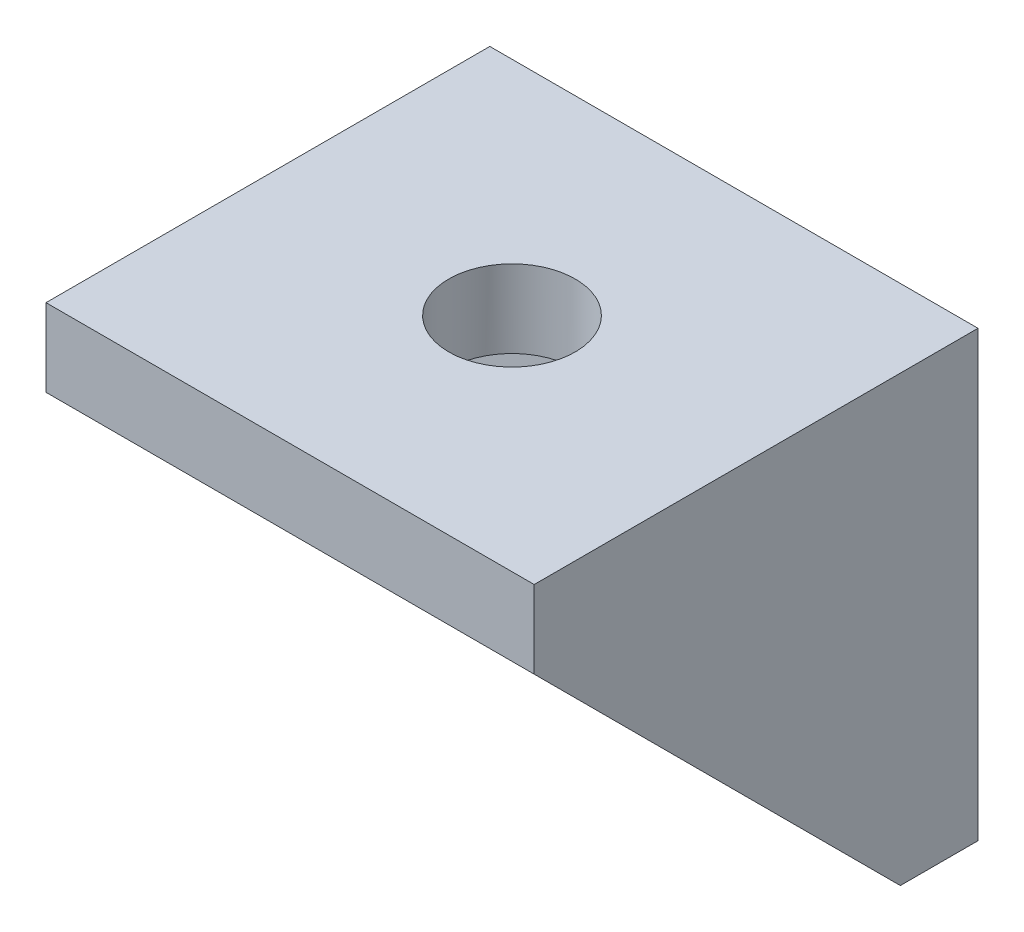
ISO-10303-21;
HEADER;
FILE_DESCRIPTION(('STEP AP214'),'2;1');
FILE_NAME('part.step','',(''),(''),'','','');
FILE_SCHEMA(('AUTOMOTIVE_DESIGN { 1 0 10303 214 1 1 1 1 }'));
ENDSEC;
DATA;
#1=APPLICATION_CONTEXT('core data for automotive mechanical design processes');
#2=APPLICATION_PROTOCOL_DEFINITION('international standard','automotive_design',2000,#1);
#3=PRODUCT_CONTEXT('',#1,'mechanical');
#4=PRODUCT('Part','Part','',(#3));
#5=PRODUCT_RELATED_PRODUCT_CATEGORY('part','',(#4));
#6=PRODUCT_DEFINITION_FORMATION('','',#4);
#7=PRODUCT_DEFINITION_CONTEXT('part definition',#1,'design');
#8=PRODUCT_DEFINITION('design','',#6,#7);
#9=PRODUCT_DEFINITION_SHAPE('','',#8);
#10=(LENGTH_UNIT() NAMED_UNIT(*) SI_UNIT(.MILLI.,.METRE.));
#11=(NAMED_UNIT(*) PLANE_ANGLE_UNIT() SI_UNIT($,.RADIAN.));
#12=(NAMED_UNIT(*) SI_UNIT($,.STERADIAN.) SOLID_ANGLE_UNIT());
#13=UNCERTAINTY_MEASURE_WITH_UNIT(LENGTH_MEASURE(1.E-05),#10,'distance_accuracy_value','');
#14=(GEOMETRIC_REPRESENTATION_CONTEXT(3) GLOBAL_UNCERTAINTY_ASSIGNED_CONTEXT((#13)) GLOBAL_UNIT_ASSIGNED_CONTEXT((#10,
#11,#12)) REPRESENTATION_CONTEXT('',''));
#15=CARTESIAN_POINT('',(0.,0.,0.));
#16=DIRECTION('',(0.,0.,1.));
#17=DIRECTION('',(1.,0.,0.));
#18=AXIS2_PLACEMENT_3D('',#15,#16,#17);
#19=CARTESIAN_POINT('',(-8.99999999999968,0.,9.99999999999888));
#20=DIRECTION('',(0.,0.,1.));
#21=DIRECTION('',(1.,0.,0.));
#22=AXIS2_PLACEMENT_3D('',#19,#20,#21);
#23=PLANE('',#22);
#24=DIRECTION('',(1.,0.,0.));
#25=VECTOR('',#24,1.);
#26=CARTESIAN_POINT('',(-8.99999999999968,0.,9.99999999999888));
#27=LINE('',#26,#25);
#28=CARTESIAN_POINT('',(-10.9999999999997,0.,9.99999999999888));
#29=VERTEX_POINT('',#28);
#30=CARTESIAN_POINT('',(-8.99999999999968,0.,9.99999999999888));
#31=VERTEX_POINT('',#30);
#32=EDGE_CURVE('E66',#29,#31,#27,.T.);
#33=ORIENTED_EDGE('',*,*,#32,.T.);
#34=DIRECTION('',(-1.,0.,0.));
#35=VECTOR('',#34,1.);
#36=CARTESIAN_POINT('',(8.99999999999968,0.,9.99999999999888));
#37=LINE('',#36,#35);
#38=CARTESIAN_POINT('',(8.99999999999968,0.,9.99999999999888));
#39=VERTEX_POINT('',#38);
#40=EDGE_CURVE('E234',#39,#31,#37,.T.);
#41=ORIENTED_EDGE('',*,*,#40,.F.);
#42=DIRECTION('',(1.,0.,0.));
#43=VECTOR('',#42,1.);
#44=CARTESIAN_POINT('',(-8.99999999999968,0.,9.99999999999888));
#45=LINE('',#44,#43);
#46=CARTESIAN_POINT('',(10.9999999999997,0.,9.99999999999888));
#47=VERTEX_POINT('',#46);
#48=EDGE_CURVE('E230',#39,#47,#45,.T.);
#49=ORIENTED_EDGE('',*,*,#48,.T.);
#50=DIRECTION('',(0.,-1.,0.));
#51=VECTOR('',#50,1.);
#52=CARTESIAN_POINT('',(10.9999999999997,3.49999999999999,9.99999999999888));
#53=LINE('',#52,#51);
#54=CARTESIAN_POINT('',(10.9999999999997,3.49999999999999,9.99999999999888));
#55=VERTEX_POINT('',#54);
#56=EDGE_CURVE('E162',#55,#47,#53,.T.);
#57=ORIENTED_EDGE('',*,*,#56,.F.);
#58=DIRECTION('',(1.,0.,0.));
#59=VECTOR('',#58,1.);
#60=CARTESIAN_POINT('',(10.9999999999997,3.49999999999999,9.99999999999888));
#61=LINE('',#60,#59);
#62=CARTESIAN_POINT('',(-10.9999999999997,3.49999999999999,9.99999999999888));
#63=VERTEX_POINT('',#62);
#64=EDGE_CURVE('E121',#63,#55,#61,.T.);
#65=ORIENTED_EDGE('',*,*,#64,.F.);
#66=DIRECTION('',(0.,-1.,0.));
#67=VECTOR('',#66,1.);
#68=CARTESIAN_POINT('',(-10.9999999999997,3.49999999999999,9.99999999999888));
#69=LINE('',#68,#67);
#70=EDGE_CURVE('E118',#63,#29,#69,.T.);
#71=ORIENTED_EDGE('',*,*,#70,.T.);
#72=EDGE_LOOP('',(#33,#41,#49,#57,#65,#71));
#73=FACE_BOUND('',#72,.T.);
#74=ADVANCED_FACE('F40',(#73),#23,.T.);
#75=CARTESIAN_POINT('',(10.9999999999997,-6.5,-1.12132525487141E-12));
#76=DIRECTION('',(-1.,0.,0.));
#77=DIRECTION('',(0.,0.,1.));
#78=AXIS2_PLACEMENT_3D('',#75,#76,#77);
#79=PLANE('',#78);
#80=DIRECTION('',(0.,0.707106781186547,0.707106781186547));
#81=VECTOR('',#80,1.);
#82=CARTESIAN_POINT('',(10.9999999999997,-16.5,-6.50000000000112));
#83=LINE('',#82,#81);
#84=CARTESIAN_POINT('',(10.9999999999997,-16.5,-6.50000000000112));
#85=VERTEX_POINT('',#84);
#86=EDGE_CURVE('E420',#85,#47,#83,.T.);
#87=ORIENTED_EDGE('',*,*,#86,.F.);
#88=DIRECTION('',(0.,0.,1.));
#89=VECTOR('',#88,1.);
#90=CARTESIAN_POINT('',(10.9999999999997,-16.5,-10.0000000000011));
#91=LINE('',#90,#89);
#92=CARTESIAN_POINT('',(10.9999999999997,-16.5,-10.0000000000011));
#93=VERTEX_POINT('',#92);
#94=EDGE_CURVE('E150',#93,#85,#91,.T.);
#95=ORIENTED_EDGE('',*,*,#94,.F.);
#96=DIRECTION('',(0.,-1.,0.));
#97=VECTOR('',#96,1.);
#98=CARTESIAN_POINT('',(10.9999999999997,-16.5,-10.0000000000011));
#99=LINE('',#98,#97);
#100=CARTESIAN_POINT('',(10.9999999999997,3.5,-10.0000000000011));
#101=VERTEX_POINT('',#100);
#102=EDGE_CURVE('E131',#101,#93,#99,.T.);
#103=ORIENTED_EDGE('',*,*,#102,.F.);
#104=DIRECTION('',(0.,0.,-1.));
#105=VECTOR('',#104,1.);
#106=CARTESIAN_POINT('',(10.9999999999997,3.49999999999999,-6.50000000000112));
#107=LINE('',#106,#105);
#108=EDGE_CURVE('E128',#55,#101,#107,.T.);
#109=ORIENTED_EDGE('',*,*,#108,.F.);
#110=ORIENTED_EDGE('',*,*,#56,.T.);
#111=EDGE_LOOP('',(#87,#95,#103,#109,#110));
#112=FACE_BOUND('',#111,.T.);
#113=ADVANCED_FACE('F273',(#112),#79,.F.);
#114=CARTESIAN_POINT('',(-10.9999999999997,-6.5,-1.12132525487141E-12));
#115=DIRECTION('',(-1.,0.,0.));
#116=DIRECTION('',(0.,0.,1.));
#117=AXIS2_PLACEMENT_3D('',#114,#115,#116);
#118=PLANE('',#117);
#119=DIRECTION('',(0.,0.707106781186547,0.707106781186547));
#120=VECTOR('',#119,1.);
#121=CARTESIAN_POINT('',(-10.9999999999997,-16.5,-6.50000000000112));
#122=LINE('',#121,#120);
#123=CARTESIAN_POINT('',(-10.9999999999997,-16.5,-6.50000000000112));
#124=VERTEX_POINT('',#123);
#125=EDGE_CURVE('E12',#124,#29,#122,.T.);
#126=ORIENTED_EDGE('',*,*,#125,.T.);
#127=ORIENTED_EDGE('',*,*,#70,.F.);
#128=DIRECTION('',(0.,0.,1.));
#129=VECTOR('',#128,1.);
#130=CARTESIAN_POINT('',(-10.9999999999997,3.49999999999999,9.99999999999888));
#131=LINE('',#130,#129);
#132=CARTESIAN_POINT('',(-10.9999999999997,3.5,-10.0000000000011));
#133=VERTEX_POINT('',#132);
#134=EDGE_CURVE('E111',#133,#63,#131,.T.);
#135=ORIENTED_EDGE('',*,*,#134,.F.);
#136=DIRECTION('',(0.,1.,0.));
#137=VECTOR('',#136,1.);
#138=CARTESIAN_POINT('',(-10.9999999999997,3.5,-10.0000000000011));
#139=LINE('',#138,#137);
#140=CARTESIAN_POINT('',(-10.9999999999997,-16.5,-10.0000000000011));
#141=VERTEX_POINT('',#140);
#142=EDGE_CURVE('E116',#141,#133,#139,.T.);
#143=ORIENTED_EDGE('',*,*,#142,.F.);
#144=DIRECTION('',(0.,0.,1.));
#145=VECTOR('',#144,1.);
#146=CARTESIAN_POINT('',(-10.9999999999997,-16.5,-10.0000000000011));
#147=LINE('',#146,#145);
#148=EDGE_CURVE('E147',#141,#124,#147,.T.);
#149=ORIENTED_EDGE('',*,*,#148,.T.);
#150=EDGE_LOOP('',(#126,#127,#135,#143,#149));
#151=FACE_BOUND('',#150,.T.);
#152=ADVANCED_FACE('F113',(#151),#118,.T.);
#153=CARTESIAN_POINT('',(8.99999999999968,-16.5,-6.50000000000112));
#154=DIRECTION('',(0.,0.707106781186547,-0.707106781186548));
#155=DIRECTION('',(0.,0.707106781186548,0.707106781186547));
#156=AXIS2_PLACEMENT_3D('',#153,#154,#155);
#157=PLANE('',#156);
#158=DIRECTION('',(1.,0.,0.));
#159=VECTOR('',#158,1.);
#160=CARTESIAN_POINT('',(3.17523785042795E-13,-16.5,-6.50000000000112));
#161=LINE('',#160,#159);
#162=CARTESIAN_POINT('',(8.99999999999968,-16.5,-6.50000000000112));
#163=VERTEX_POINT('',#162);
#164=EDGE_CURVE('E423',#85,#163,#161,.F.);
#165=ORIENTED_EDGE('',*,*,#164,.F.);
#166=ORIENTED_EDGE('',*,*,#86,.T.);
#167=ORIENTED_EDGE('',*,*,#48,.F.);
#168=DIRECTION('',(0.,0.707106781186548,0.707106781186547));
#169=VECTOR('',#168,1.);
#170=CARTESIAN_POINT('',(9.00000000000032,-16.5,-6.50000000000112));
#171=LINE('',#170,#169);
#172=EDGE_CURVE('E165',#163,#39,#171,.T.);
#173=ORIENTED_EDGE('',*,*,#172,.F.);
#174=EDGE_LOOP('',(#165,#166,#167,#173));
#175=FACE_BOUND('',#174,.T.);
#176=ADVANCED_FACE('F42',(#175),#157,.F.);
#177=CARTESIAN_POINT('',(-8.99999999999968,-16.5,-6.50000000000112));
#178=DIRECTION('',(0.,-0.707106781186547,0.707106781186548));
#179=DIRECTION('',(0.,-0.707106781186548,-0.707106781186547));
#180=AXIS2_PLACEMENT_3D('',#177,#178,#179);
#181=PLANE('',#180);
#182=ORIENTED_EDGE('',*,*,#125,.F.);
#183=DIRECTION('',(1.,0.,0.));
#184=VECTOR('',#183,1.);
#185=CARTESIAN_POINT('',(3.17523785042795E-13,-16.5,-6.50000000000112));
#186=LINE('',#185,#184);
#187=CARTESIAN_POINT('',(-8.99999999999968,-16.5,-6.50000000000112));
#188=VERTEX_POINT('',#187);
#189=EDGE_CURVE('E50',#188,#124,#186,.F.);
#190=ORIENTED_EDGE('',*,*,#189,.F.);
#191=DIRECTION('',(0.,-0.707106781186548,-0.707106781186547));
#192=VECTOR('',#191,1.);
#193=CARTESIAN_POINT('',(-8.99999999999968,-16.5,-6.50000000000112));
#194=LINE('',#193,#192);
#195=EDGE_CURVE('E225',#188,#31,#194,.F.);
#196=ORIENTED_EDGE('',*,*,#195,.T.);
#197=ORIENTED_EDGE('',*,*,#32,.F.);
#198=EDGE_LOOP('',(#182,#190,#196,#197));
#199=FACE_BOUND('',#198,.T.);
#200=ADVANCED_FACE('F260',(#199),#181,.T.);
#201=CARTESIAN_POINT('',(0.,3.49999999999999,0.));
#202=DIRECTION('',(0.,-1.,0.));
#203=DIRECTION('',(0.,0.,-1.));
#204=AXIS2_PLACEMENT_3D('',#201,#202,#203);
#205=PLANE('',#204);
#206=CARTESIAN_POINT('',(0.,3.5,0.));
#207=DIRECTION('',(0.,1.,0.));
#208=DIRECTION('',(0.,0.,1.));
#209=AXIS2_PLACEMENT_3D('',#206,#207,#208);
#210=CIRCLE('',#209,2.84999999999999);
#211=CARTESIAN_POINT('',(0.,3.5,2.84999999999999));
#212=VERTEX_POINT('',#211);
#213=EDGE_CURVE('E250',#212,#212,#210,.T.);
#214=ORIENTED_EDGE('',*,*,#213,.F.);
#215=EDGE_LOOP('',(#214));
#216=FACE_BOUND('',#215,.T.);
#217=ORIENTED_EDGE('',*,*,#108,.T.);
#218=DIRECTION('',(1.,0.,0.));
#219=VECTOR('',#218,1.);
#220=CARTESIAN_POINT('',(10.9999999999997,3.5,-10.0000000000011));
#221=LINE('',#220,#219);
#222=EDGE_CURVE('E125',#133,#101,#221,.T.);
#223=ORIENTED_EDGE('',*,*,#222,.F.);
#224=ORIENTED_EDGE('',*,*,#134,.T.);
#225=ORIENTED_EDGE('',*,*,#64,.T.);
#226=EDGE_LOOP('',(#217,#223,#224,#225));
#227=FACE_BOUND('',#226,.T.);
#228=ADVANCED_FACE('F126',(#216,#227),#205,.F.);
#229=CARTESIAN_POINT('',(8.99999999999968,0.,-6.50000000000112));
#230=DIRECTION('',(1.,0.,0.));
#231=DIRECTION('',(0.,0.,-1.));
#232=AXIS2_PLACEMENT_3D('',#229,#230,#231);
#233=PLANE('',#232);
#234=DIRECTION('',(0.,0.,1.));
#235=VECTOR('',#234,1.);
#236=CARTESIAN_POINT('',(8.99999999999968,0.,-6.50000000000112));
#237=LINE('',#236,#235);
#238=CARTESIAN_POINT('',(8.99999999999968,0.,-6.50000000000112));
#239=VERTEX_POINT('',#238);
#240=EDGE_CURVE('E155',#239,#39,#237,.T.);
#241=ORIENTED_EDGE('',*,*,#240,.F.);
#242=DIRECTION('',(0.,-1.,0.));
#243=VECTOR('',#242,1.);
#244=CARTESIAN_POINT('',(8.99999999999968,0.,-6.50000000000112));
#245=LINE('',#244,#243);
#246=EDGE_CURVE('E157',#239,#163,#245,.T.);
#247=ORIENTED_EDGE('',*,*,#246,.T.);
#248=ORIENTED_EDGE('',*,*,#172,.T.);
#249=EDGE_LOOP('',(#241,#247,#248));
#250=FACE_BOUND('',#249,.T.);
#251=ADVANCED_FACE('F259',(#250),#233,.F.);
#252=CARTESIAN_POINT('',(-8.99999999999968,0.,9.99999999999888));
#253=DIRECTION('',(-1.,0.,0.));
#254=DIRECTION('',(0.,0.,1.));
#255=AXIS2_PLACEMENT_3D('',#252,#253,#254);
#256=PLANE('',#255);
#257=ORIENTED_EDGE('',*,*,#195,.F.);
#258=DIRECTION('',(0.,-1.,0.));
#259=VECTOR('',#258,1.);
#260=CARTESIAN_POINT('',(-8.99999999999968,0.,-6.50000000000112));
#261=LINE('',#260,#259);
#262=CARTESIAN_POINT('',(-8.99999999999968,0.,-6.50000000000112));
#263=VERTEX_POINT('',#262);
#264=EDGE_CURVE('E122',#263,#188,#261,.T.);
#265=ORIENTED_EDGE('',*,*,#264,.F.);
#266=DIRECTION('',(0.,0.,-1.));
#267=VECTOR('',#266,1.);
#268=CARTESIAN_POINT('',(-8.99999999999968,0.,9.99999999999888));
#269=LINE('',#268,#267);
#270=EDGE_CURVE('E58',#31,#263,#269,.T.);
#271=ORIENTED_EDGE('',*,*,#270,.F.);
#272=EDGE_LOOP('',(#257,#265,#271));
#273=FACE_BOUND('',#272,.T.);
#274=ADVANCED_FACE('F266',(#273),#256,.F.);
#275=CARTESIAN_POINT('',(0.,0.,0.));
#276=DIRECTION('',(0.,-1.,0.));
#277=DIRECTION('',(0.,0.,-1.));
#278=AXIS2_PLACEMENT_3D('',#275,#276,#277);
#279=PLANE('',#278);
#280=CARTESIAN_POINT('',(0.,0.,0.));
#281=DIRECTION('',(0.,-1.,0.));
#282=DIRECTION('',(0.,0.,-1.));
#283=AXIS2_PLACEMENT_3D('',#280,#281,#282);
#284=CIRCLE('',#283,2.84999999999999);
#285=CARTESIAN_POINT('',(0.,0.,-2.84999999999999));
#286=VERTEX_POINT('',#285);
#287=EDGE_CURVE('E44',#286,#286,#284,.T.);
#288=ORIENTED_EDGE('',*,*,#287,.F.);
#289=EDGE_LOOP('',(#288));
#290=FACE_BOUND('',#289,.T.);
#291=DIRECTION('',(1.,0.,0.));
#292=VECTOR('',#291,1.);
#293=CARTESIAN_POINT('',(-8.99999999999968,0.,-6.50000000000112));
#294=LINE('',#293,#292);
#295=EDGE_CURVE('E152',#263,#239,#294,.T.);
#296=ORIENTED_EDGE('',*,*,#295,.T.);
#297=ORIENTED_EDGE('',*,*,#240,.T.);
#298=ORIENTED_EDGE('',*,*,#40,.T.);
#299=ORIENTED_EDGE('',*,*,#270,.T.);
#300=EDGE_LOOP('',(#296,#297,#298,#299));
#301=FACE_BOUND('',#300,.T.);
#302=ADVANCED_FACE('F311',(#290,#301),#279,.T.);
#303=CARTESIAN_POINT('',(-10.9999999999997,-16.5,-10.0000000000011));
#304=DIRECTION('',(0.,1.,0.));
#305=DIRECTION('',(0.,0.,1.));
#306=AXIS2_PLACEMENT_3D('',#303,#304,#305);
#307=PLANE('',#306);
#308=ORIENTED_EDGE('',*,*,#164,.T.);
#309=DIRECTION('',(-1.,0.,0.));
#310=VECTOR('',#309,1.);
#311=CARTESIAN_POINT('',(-10.9999999999997,-16.5,-6.50000000000112));
#312=LINE('',#311,#310);
#313=EDGE_CURVE('E137',#163,#188,#312,.T.);
#314=ORIENTED_EDGE('',*,*,#313,.T.);
#315=ORIENTED_EDGE('',*,*,#189,.T.);
#316=ORIENTED_EDGE('',*,*,#148,.F.);
#317=DIRECTION('',(-1.,0.,0.));
#318=VECTOR('',#317,1.);
#319=CARTESIAN_POINT('',(-10.9999999999997,-16.5,-10.0000000000011));
#320=LINE('',#319,#318);
#321=EDGE_CURVE('E135',#93,#141,#320,.T.);
#322=ORIENTED_EDGE('',*,*,#321,.F.);
#323=ORIENTED_EDGE('',*,*,#94,.T.);
#324=EDGE_LOOP('',(#308,#314,#315,#316,#322,#323));
#325=FACE_BOUND('',#324,.T.);
#326=ADVANCED_FACE('F318',(#325),#307,.F.);
#327=CARTESIAN_POINT('',(0.,0.,-10.0000000000011));
#328=DIRECTION('',(0.,0.,1.));
#329=DIRECTION('',(1.,0.,0.));
#330=AXIS2_PLACEMENT_3D('',#327,#328,#329);
#331=PLANE('',#330);
#332=CARTESIAN_POINT('',(3.18510649953573E-13,-6.5,-10.0000000000011));
#333=DIRECTION('',(0.,0.,-1.));
#334=DIRECTION('',(-1.,0.,0.));
#335=AXIS2_PLACEMENT_3D('',#332,#333,#334);
#336=CIRCLE('',#335,2.84999999999999);
#337=CARTESIAN_POINT('',(-2.84999999999967,-6.5,-10.0000000000011));
#338=VERTEX_POINT('',#337);
#339=EDGE_CURVE('E143',#338,#338,#336,.T.);
#340=ORIENTED_EDGE('',*,*,#339,.F.);
#341=EDGE_LOOP('',(#340));
#342=FACE_BOUND('',#341,.T.);
#343=ORIENTED_EDGE('',*,*,#142,.T.);
#344=ORIENTED_EDGE('',*,*,#222,.T.);
#345=ORIENTED_EDGE('',*,*,#102,.T.);
#346=ORIENTED_EDGE('',*,*,#321,.T.);
#347=EDGE_LOOP('',(#343,#344,#345,#346));
#348=FACE_BOUND('',#347,.T.);
#349=ADVANCED_FACE('F133',(#342,#348),#331,.F.);
#350=CARTESIAN_POINT('',(0.,0.,-6.50000000000112));
#351=DIRECTION('',(0.,0.,1.));
#352=DIRECTION('',(1.,0.,0.));
#353=AXIS2_PLACEMENT_3D('',#350,#351,#352);
#354=PLANE('',#353);
#355=CARTESIAN_POINT('',(3.18510649953573E-13,-6.5,-6.50000000000112));
#356=DIRECTION('',(0.,0.,1.));
#357=DIRECTION('',(1.,0.,0.));
#358=AXIS2_PLACEMENT_3D('',#355,#356,#357);
#359=CIRCLE('',#358,2.84999999999999);
#360=CARTESIAN_POINT('',(2.85000000000031,-6.5,-6.50000000000112));
#361=VERTEX_POINT('',#360);
#362=EDGE_CURVE('E140',#361,#361,#359,.T.);
#363=ORIENTED_EDGE('',*,*,#362,.F.);
#364=EDGE_LOOP('',(#363));
#365=FACE_BOUND('',#364,.T.);
#366=ORIENTED_EDGE('',*,*,#295,.F.);
#367=ORIENTED_EDGE('',*,*,#264,.T.);
#368=ORIENTED_EDGE('',*,*,#313,.F.);
#369=ORIENTED_EDGE('',*,*,#246,.F.);
#370=EDGE_LOOP('',(#366,#367,#368,#369));
#371=FACE_BOUND('',#370,.T.);
#372=ADVANCED_FACE('F333',(#365,#371),#354,.T.);
#373=CARTESIAN_POINT('',(3.18510649953573E-13,-6.5,-10.0000000000011));
#374=DIRECTION('',(0.,0.,-1.));
#375=DIRECTION('',(-1.,0.,0.));
#376=AXIS2_PLACEMENT_3D('',#373,#374,#375);
#377=CYLINDRICAL_SURFACE('',#376,2.84999999999999);
#378=ORIENTED_EDGE('',*,*,#362,.T.);
#379=EDGE_LOOP('',(#378));
#380=FACE_BOUND('',#379,.T.);
#381=ORIENTED_EDGE('',*,*,#339,.T.);
#382=EDGE_LOOP('',(#381));
#383=FACE_BOUND('',#382,.T.);
#384=ADVANCED_FACE('F343',(#380,#383),#377,.F.);
#385=CARTESIAN_POINT('',(0.,3.49999999999999,0.));
#386=DIRECTION('',(0.,1.,0.));
#387=DIRECTION('',(0.,0.,1.));
#388=AXIS2_PLACEMENT_3D('',#385,#386,#387);
#389=CYLINDRICAL_SURFACE('',#388,2.84999999999999);
#390=ORIENTED_EDGE('',*,*,#287,.T.);
#391=EDGE_LOOP('',(#390));
#392=FACE_BOUND('',#391,.T.);
#393=ORIENTED_EDGE('',*,*,#213,.T.);
#394=EDGE_LOOP('',(#393));
#395=FACE_BOUND('',#394,.T.);
#396=ADVANCED_FACE('F256',(#392,#395),#389,.F.);
#397=CLOSED_SHELL('',(#74,#113,#152,#176,#200,#228,#251,#274,#302,#326,#349,#372,#384,#396));
#398=MANIFOLD_SOLID_BREP('B2',#397);
#399=ADVANCED_BREP_SHAPE_REPRESENTATION('',(#18,#398),#14);
#400=SHAPE_DEFINITION_REPRESENTATION(#9,#399);
ENDSEC;
END-ISO-10303-21;
